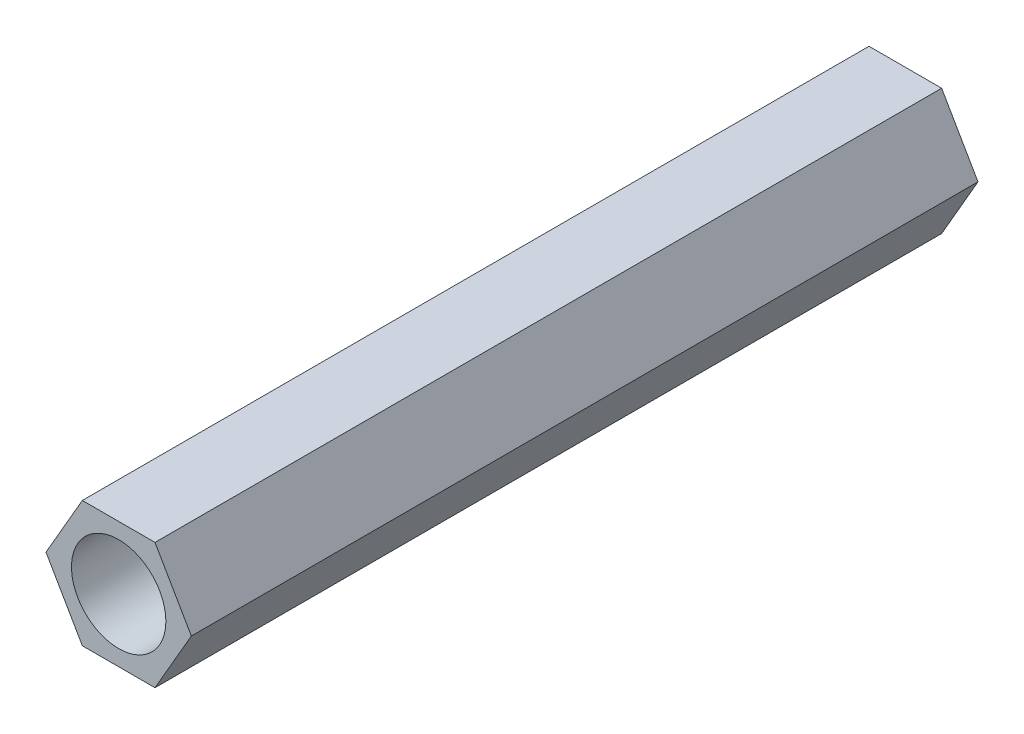
ISO-10303-21;
HEADER;
FILE_DESCRIPTION(('STEP AP214'),'2;1');
FILE_NAME('part.step','',(''),(''),'','','');
FILE_SCHEMA(('AUTOMOTIVE_DESIGN { 1 0 10303 214 1 1 1 1 }'));
ENDSEC;
DATA;
#1=APPLICATION_CONTEXT('core data for automotive mechanical design processes');
#2=APPLICATION_PROTOCOL_DEFINITION('international standard','automotive_design',2000,#1);
#3=PRODUCT_CONTEXT('',#1,'mechanical');
#4=PRODUCT('Part','Part','',(#3));
#5=PRODUCT_RELATED_PRODUCT_CATEGORY('part','',(#4));
#6=PRODUCT_DEFINITION_FORMATION('','',#4);
#7=PRODUCT_DEFINITION_CONTEXT('part definition',#1,'design');
#8=PRODUCT_DEFINITION('design','',#6,#7);
#9=PRODUCT_DEFINITION_SHAPE('','',#8);
#10=(LENGTH_UNIT() NAMED_UNIT(*) SI_UNIT(.MILLI.,.METRE.));
#11=(NAMED_UNIT(*) PLANE_ANGLE_UNIT() SI_UNIT($,.RADIAN.));
#12=(NAMED_UNIT(*) SI_UNIT($,.STERADIAN.) SOLID_ANGLE_UNIT());
#13=UNCERTAINTY_MEASURE_WITH_UNIT(LENGTH_MEASURE(1.E-05),#10,'distance_accuracy_value','');
#14=(GEOMETRIC_REPRESENTATION_CONTEXT(3) GLOBAL_UNCERTAINTY_ASSIGNED_CONTEXT((#13)) GLOBAL_UNIT_ASSIGNED_CONTEXT((#10,
#11,#12)) REPRESENTATION_CONTEXT('',''));
#15=CARTESIAN_POINT('',(0.,0.,0.));
#16=DIRECTION('',(0.,0.,1.));
#17=DIRECTION('',(1.,0.,0.));
#18=AXIS2_PLACEMENT_3D('',#15,#16,#17);
#19=CARTESIAN_POINT('',(0.,0.,25.));
#20=DIRECTION('',(0.,0.,1.));
#21=DIRECTION('',(1.,0.,0.));
#22=AXIS2_PLACEMENT_3D('',#19,#20,#21);
#23=PLANE('',#22);
#24=DIRECTION('',(0.5,0.866025403784439,0.));
#25=VECTOR('',#24,1.);
#26=CARTESIAN_POINT('',(1.15470053837925,-2.,25.));
#27=LINE('',#26,#25);
#28=CARTESIAN_POINT('',(1.15470053837925,-2.,25.));
#29=VERTEX_POINT('',#28);
#30=CARTESIAN_POINT('',(2.3094010767585,0.,25.));
#31=VERTEX_POINT('',#30);
#32=EDGE_CURVE('E150',#29,#31,#27,.T.);
#33=ORIENTED_EDGE('',*,*,#32,.T.);
#34=DIRECTION('',(-0.5,0.866025403784439,0.));
#35=VECTOR('',#34,1.);
#36=CARTESIAN_POINT('',(2.3094010767585,0.,25.));
#37=LINE('',#36,#35);
#38=CARTESIAN_POINT('',(1.15470053837925,2.,25.));
#39=VERTEX_POINT('',#38);
#40=EDGE_CURVE('E98',#31,#39,#37,.T.);
#41=ORIENTED_EDGE('',*,*,#40,.T.);
#42=DIRECTION('',(-1.,0.,0.));
#43=VECTOR('',#42,1.);
#44=CARTESIAN_POINT('',(1.15470053837925,2.,25.));
#45=LINE('',#44,#43);
#46=CARTESIAN_POINT('',(-1.15470053837925,2.,25.));
#47=VERTEX_POINT('',#46);
#48=EDGE_CURVE('E111',#39,#47,#45,.T.);
#49=ORIENTED_EDGE('',*,*,#48,.T.);
#50=DIRECTION('',(-0.5,-0.866025403784439,0.));
#51=VECTOR('',#50,1.);
#52=CARTESIAN_POINT('',(-1.15470053837925,2.,25.));
#53=LINE('',#52,#51);
#54=CARTESIAN_POINT('',(-2.3094010767585,0.,25.));
#55=VERTEX_POINT('',#54);
#56=EDGE_CURVE('E105',#47,#55,#53,.T.);
#57=ORIENTED_EDGE('',*,*,#56,.T.);
#58=DIRECTION('',(0.5,-0.866025403784438,0.));
#59=VECTOR('',#58,1.);
#60=CARTESIAN_POINT('',(-2.3094010767585,0.,25.));
#61=LINE('',#60,#59);
#62=CARTESIAN_POINT('',(-1.15470053837925,-2.,25.));
#63=VERTEX_POINT('',#62);
#64=EDGE_CURVE('E109',#55,#63,#61,.T.);
#65=ORIENTED_EDGE('',*,*,#64,.T.);
#66=DIRECTION('',(1.,0.,0.));
#67=VECTOR('',#66,1.);
#68=CARTESIAN_POINT('',(-1.15470053837925,-2.,25.));
#69=LINE('',#68,#67);
#70=EDGE_CURVE('E61',#63,#29,#69,.T.);
#71=ORIENTED_EDGE('',*,*,#70,.T.);
#72=EDGE_LOOP('',(#33,#41,#49,#57,#65,#71));
#73=FACE_BOUND('',#72,.T.);
#74=CARTESIAN_POINT('',(0.,0.,25.));
#75=DIRECTION('',(0.,0.,1.));
#76=DIRECTION('',(1.,0.,0.));
#77=AXIS2_PLACEMENT_3D('',#74,#75,#76);
#78=CIRCLE('',#77,1.5);
#79=CARTESIAN_POINT('',(1.5,0.,25.));
#80=VERTEX_POINT('',#79);
#81=EDGE_CURVE('E138',#80,#80,#78,.T.);
#82=ORIENTED_EDGE('',*,*,#81,.F.);
#83=EDGE_LOOP('',(#82));
#84=FACE_BOUND('',#83,.T.);
#85=ADVANCED_FACE('F43',(#73,#84),#23,.T.);
#86=CARTESIAN_POINT('',(0.,0.,0.));
#87=DIRECTION('',(0.,0.,1.));
#88=DIRECTION('',(1.,0.,0.));
#89=AXIS2_PLACEMENT_3D('',#86,#87,#88);
#90=PLANE('',#89);
#91=DIRECTION('',(0.5,0.866025403784439,0.));
#92=VECTOR('',#91,1.);
#93=CARTESIAN_POINT('',(1.15470053837925,-2.,0.));
#94=LINE('',#93,#92);
#95=CARTESIAN_POINT('',(1.15470053837925,-2.,0.));
#96=VERTEX_POINT('',#95);
#97=CARTESIAN_POINT('',(2.3094010767585,0.,0.));
#98=VERTEX_POINT('',#97);
#99=EDGE_CURVE('E133',#96,#98,#94,.T.);
#100=ORIENTED_EDGE('',*,*,#99,.F.);
#101=DIRECTION('',(1.,0.,0.));
#102=VECTOR('',#101,1.);
#103=CARTESIAN_POINT('',(-1.15470053837925,-2.,0.));
#104=LINE('',#103,#102);
#105=CARTESIAN_POINT('',(-1.15470053837925,-2.,0.));
#106=VERTEX_POINT('',#105);
#107=EDGE_CURVE('E90',#106,#96,#104,.T.);
#108=ORIENTED_EDGE('',*,*,#107,.F.);
#109=DIRECTION('',(0.5,-0.866025403784438,0.));
#110=VECTOR('',#109,1.);
#111=CARTESIAN_POINT('',(-2.3094010767585,0.,0.));
#112=LINE('',#111,#110);
#113=CARTESIAN_POINT('',(-2.3094010767585,0.,0.));
#114=VERTEX_POINT('',#113);
#115=EDGE_CURVE('E84',#114,#106,#112,.T.);
#116=ORIENTED_EDGE('',*,*,#115,.F.);
#117=DIRECTION('',(-0.5,-0.866025403784439,0.));
#118=VECTOR('',#117,1.);
#119=CARTESIAN_POINT('',(-1.15470053837925,2.,0.));
#120=LINE('',#119,#118);
#121=CARTESIAN_POINT('',(-1.15470053837925,2.,0.));
#122=VERTEX_POINT('',#121);
#123=EDGE_CURVE('E120',#122,#114,#120,.T.);
#124=ORIENTED_EDGE('',*,*,#123,.F.);
#125=DIRECTION('',(-1.,0.,0.));
#126=VECTOR('',#125,1.);
#127=CARTESIAN_POINT('',(1.15470053837925,2.,0.));
#128=LINE('',#127,#126);
#129=CARTESIAN_POINT('',(1.15470053837925,2.,0.));
#130=VERTEX_POINT('',#129);
#131=EDGE_CURVE('E141',#130,#122,#128,.T.);
#132=ORIENTED_EDGE('',*,*,#131,.F.);
#133=DIRECTION('',(-0.5,0.866025403784439,0.));
#134=VECTOR('',#133,1.);
#135=CARTESIAN_POINT('',(2.3094010767585,0.,0.));
#136=LINE('',#135,#134);
#137=EDGE_CURVE('E137',#98,#130,#136,.T.);
#138=ORIENTED_EDGE('',*,*,#137,.F.);
#139=EDGE_LOOP('',(#100,#108,#116,#124,#132,#138));
#140=FACE_BOUND('',#139,.T.);
#141=CARTESIAN_POINT('',(0.,0.,0.));
#142=DIRECTION('',(0.,0.,1.));
#143=DIRECTION('',(1.,0.,0.));
#144=AXIS2_PLACEMENT_3D('',#141,#142,#143);
#145=CIRCLE('',#144,1.5);
#146=CARTESIAN_POINT('',(1.5,0.,0.));
#147=VERTEX_POINT('',#146);
#148=EDGE_CURVE('E265',#147,#147,#145,.T.);
#149=ORIENTED_EDGE('',*,*,#148,.T.);
#150=EDGE_LOOP('',(#149));
#151=FACE_BOUND('',#150,.T.);
#152=ADVANCED_FACE('F163',(#140,#151),#90,.F.);
#153=CARTESIAN_POINT('',(1.15470053837925,-2.,25.));
#154=DIRECTION('',(-0.866025403784439,0.5,0.));
#155=DIRECTION('',(-0.5,-0.866025403784439,0.));
#156=AXIS2_PLACEMENT_3D('',#153,#154,#155);
#157=PLANE('',#156);
#158=ORIENTED_EDGE('',*,*,#99,.T.);
#159=DIRECTION('',(0.,0.,-1.));
#160=VECTOR('',#159,1.);
#161=CARTESIAN_POINT('',(2.3094010767585,0.,25.));
#162=LINE('',#161,#160);
#163=EDGE_CURVE('E11',#31,#98,#162,.T.);
#164=ORIENTED_EDGE('',*,*,#163,.F.);
#165=ORIENTED_EDGE('',*,*,#32,.F.);
#166=DIRECTION('',(0.,0.,-1.));
#167=VECTOR('',#166,1.);
#168=CARTESIAN_POINT('',(1.15470053837925,-2.,25.));
#169=LINE('',#168,#167);
#170=EDGE_CURVE('E129',#29,#96,#169,.T.);
#171=ORIENTED_EDGE('',*,*,#170,.T.);
#172=EDGE_LOOP('',(#158,#164,#165,#171));
#173=FACE_BOUND('',#172,.T.);
#174=ADVANCED_FACE('F45',(#173),#157,.F.);
#175=CARTESIAN_POINT('',(2.3094010767585,0.,25.));
#176=DIRECTION('',(-0.866025403784439,-0.5,0.));
#177=DIRECTION('',(0.5,-0.866025403784439,0.));
#178=AXIS2_PLACEMENT_3D('',#175,#176,#177);
#179=PLANE('',#178);
#180=ORIENTED_EDGE('',*,*,#137,.T.);
#181=DIRECTION('',(0.,0.,-1.));
#182=VECTOR('',#181,1.);
#183=CARTESIAN_POINT('',(1.15470053837925,2.,25.));
#184=LINE('',#183,#182);
#185=EDGE_CURVE('E53',#39,#130,#184,.T.);
#186=ORIENTED_EDGE('',*,*,#185,.F.);
#187=ORIENTED_EDGE('',*,*,#40,.F.);
#188=ORIENTED_EDGE('',*,*,#163,.T.);
#189=EDGE_LOOP('',(#180,#186,#187,#188));
#190=FACE_BOUND('',#189,.T.);
#191=ADVANCED_FACE('F188',(#190),#179,.F.);
#192=CARTESIAN_POINT('',(1.15470053837925,2.,25.));
#193=DIRECTION('',(0.,-1.,0.));
#194=DIRECTION('',(0.,0.,-1.));
#195=AXIS2_PLACEMENT_3D('',#192,#193,#194);
#196=PLANE('',#195);
#197=ORIENTED_EDGE('',*,*,#131,.T.);
#198=DIRECTION('',(0.,0.,-1.));
#199=VECTOR('',#198,1.);
#200=CARTESIAN_POINT('',(-1.15470053837925,2.,25.));
#201=LINE('',#200,#199);
#202=EDGE_CURVE('E122',#47,#122,#201,.T.);
#203=ORIENTED_EDGE('',*,*,#202,.F.);
#204=ORIENTED_EDGE('',*,*,#48,.F.);
#205=ORIENTED_EDGE('',*,*,#185,.T.);
#206=EDGE_LOOP('',(#197,#203,#204,#205));
#207=FACE_BOUND('',#206,.T.);
#208=ADVANCED_FACE('F160',(#207),#196,.F.);
#209=CARTESIAN_POINT('',(-1.15470053837925,2.,25.));
#210=DIRECTION('',(0.866025403784439,-0.5,0.));
#211=DIRECTION('',(0.5,0.866025403784439,0.));
#212=AXIS2_PLACEMENT_3D('',#209,#210,#211);
#213=PLANE('',#212);
#214=ORIENTED_EDGE('',*,*,#123,.T.);
#215=DIRECTION('',(0.,0.,-1.));
#216=VECTOR('',#215,1.);
#217=CARTESIAN_POINT('',(-2.3094010767585,0.,25.));
#218=LINE('',#217,#216);
#219=EDGE_CURVE('E117',#55,#114,#218,.T.);
#220=ORIENTED_EDGE('',*,*,#219,.F.);
#221=ORIENTED_EDGE('',*,*,#56,.F.);
#222=ORIENTED_EDGE('',*,*,#202,.T.);
#223=EDGE_LOOP('',(#214,#220,#221,#222));
#224=FACE_BOUND('',#223,.T.);
#225=ADVANCED_FACE('F118',(#224),#213,.F.);
#226=CARTESIAN_POINT('',(-2.3094010767585,0.,25.));
#227=DIRECTION('',(0.866025403784438,0.5,0.));
#228=DIRECTION('',(-0.5,0.866025403784438,0.));
#229=AXIS2_PLACEMENT_3D('',#226,#227,#228);
#230=PLANE('',#229);
#231=ORIENTED_EDGE('',*,*,#115,.T.);
#232=DIRECTION('',(0.,0.,-1.));
#233=VECTOR('',#232,1.);
#234=CARTESIAN_POINT('',(-1.15470053837925,-2.,25.));
#235=LINE('',#234,#233);
#236=EDGE_CURVE('E123',#63,#106,#235,.T.);
#237=ORIENTED_EDGE('',*,*,#236,.F.);
#238=ORIENTED_EDGE('',*,*,#64,.F.);
#239=ORIENTED_EDGE('',*,*,#219,.T.);
#240=EDGE_LOOP('',(#231,#237,#238,#239));
#241=FACE_BOUND('',#240,.T.);
#242=ADVANCED_FACE('F125',(#241),#230,.F.);
#243=CARTESIAN_POINT('',(-1.15470053837925,-2.,25.));
#244=DIRECTION('',(0.,1.,0.));
#245=DIRECTION('',(0.,0.,1.));
#246=AXIS2_PLACEMENT_3D('',#243,#244,#245);
#247=PLANE('',#246);
#248=ORIENTED_EDGE('',*,*,#107,.T.);
#249=ORIENTED_EDGE('',*,*,#170,.F.);
#250=ORIENTED_EDGE('',*,*,#70,.F.);
#251=ORIENTED_EDGE('',*,*,#236,.T.);
#252=EDGE_LOOP('',(#248,#249,#250,#251));
#253=FACE_BOUND('',#252,.T.);
#254=ADVANCED_FACE('F168',(#253),#247,.F.);
#255=CARTESIAN_POINT('',(0.,0.,25.));
#256=DIRECTION('',(0.,0.,-1.));
#257=DIRECTION('',(-1.,0.,0.));
#258=AXIS2_PLACEMENT_3D('',#255,#256,#257);
#259=CYLINDRICAL_SURFACE('',#258,1.5);
#260=ORIENTED_EDGE('',*,*,#81,.T.);
#261=EDGE_LOOP('',(#260));
#262=FACE_BOUND('',#261,.T.);
#263=ORIENTED_EDGE('',*,*,#148,.F.);
#264=EDGE_LOOP('',(#263));
#265=FACE_BOUND('',#264,.T.);
#266=ADVANCED_FACE('F170',(#262,#265),#259,.F.);
#267=CLOSED_SHELL('',(#85,#152,#174,#191,#208,#225,#242,#254,#266));
#268=MANIFOLD_SOLID_BREP('B2',#267);
#269=ADVANCED_BREP_SHAPE_REPRESENTATION('',(#18,#268),#14);
#270=SHAPE_DEFINITION_REPRESENTATION(#9,#269);
ENDSEC;
END-ISO-10303-21;
